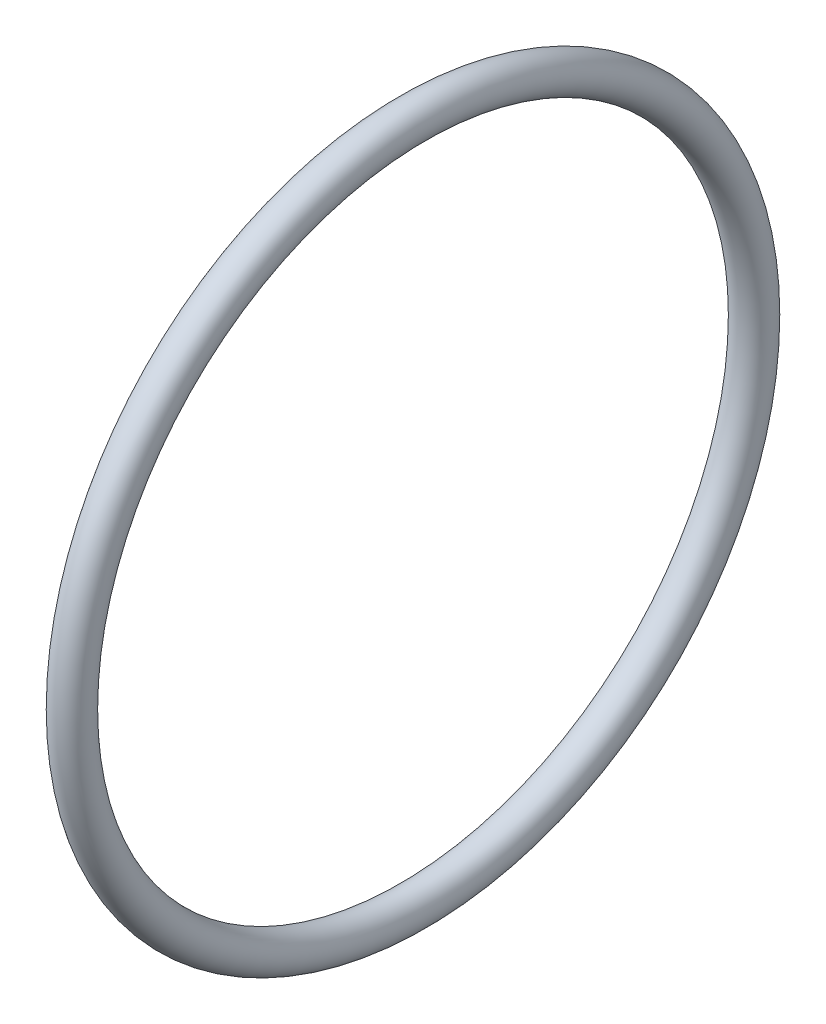
ISO-10303-21;
HEADER;
FILE_DESCRIPTION(('STEP AP214'),'2;1');
FILE_NAME('part.step','',(''),(''),'','','');
FILE_SCHEMA(('AUTOMOTIVE_DESIGN { 1 0 10303 214 1 1 1 1 }'));
ENDSEC;
DATA;
#1=APPLICATION_CONTEXT('core data for automotive mechanical design processes');
#2=APPLICATION_PROTOCOL_DEFINITION('international standard','automotive_design',2000,#1);
#3=PRODUCT_CONTEXT('',#1,'mechanical');
#4=PRODUCT('Part','Part','',(#3));
#5=PRODUCT_RELATED_PRODUCT_CATEGORY('part','',(#4));
#6=PRODUCT_DEFINITION_FORMATION('','',#4);
#7=PRODUCT_DEFINITION_CONTEXT('part definition',#1,'design');
#8=PRODUCT_DEFINITION('design','',#6,#7);
#9=PRODUCT_DEFINITION_SHAPE('','',#8);
#10=(LENGTH_UNIT() NAMED_UNIT(*) SI_UNIT(.MILLI.,.METRE.));
#11=(NAMED_UNIT(*) PLANE_ANGLE_UNIT() SI_UNIT($,.RADIAN.));
#12=(NAMED_UNIT(*) SI_UNIT($,.STERADIAN.) SOLID_ANGLE_UNIT());
#13=UNCERTAINTY_MEASURE_WITH_UNIT(LENGTH_MEASURE(1.E-05),#10,'distance_accuracy_value','');
#14=(GEOMETRIC_REPRESENTATION_CONTEXT(3) GLOBAL_UNCERTAINTY_ASSIGNED_CONTEXT((#13)) GLOBAL_UNIT_ASSIGNED_CONTEXT((#10,
#11,#12)) REPRESENTATION_CONTEXT('',''));
#15=CARTESIAN_POINT('',(0.,0.,0.));
#16=DIRECTION('',(0.,0.,1.));
#17=DIRECTION('',(1.,0.,0.));
#18=AXIS2_PLACEMENT_3D('',#15,#16,#17);
#19=CARTESIAN_POINT('',(0.,0.,0.));
#20=DIRECTION('',(-1.,0.,0.));
#21=DIRECTION('',(0.,0.,1.));
#22=AXIS2_PLACEMENT_3D('',#19,#20,#21);
#23=TOROIDAL_SURFACE('',#22,18.75,1.);
#24=CARTESIAN_POINT('',(0.,0.,19.75));
#25=VERTEX_POINT('',#24);
#26=VERTEX_LOOP('',#25);
#27=FACE_BOUND('',#26,.T.);
#28=ADVANCED_FACE('F30',(#27),#23,.T.);
#29=CLOSED_SHELL('',(#28));
#30=MANIFOLD_SOLID_BREP('B2',#29);
#31=ADVANCED_BREP_SHAPE_REPRESENTATION('',(#18,#30),#14);
#32=SHAPE_DEFINITION_REPRESENTATION(#9,#31);
ENDSEC;
END-ISO-10303-21;
